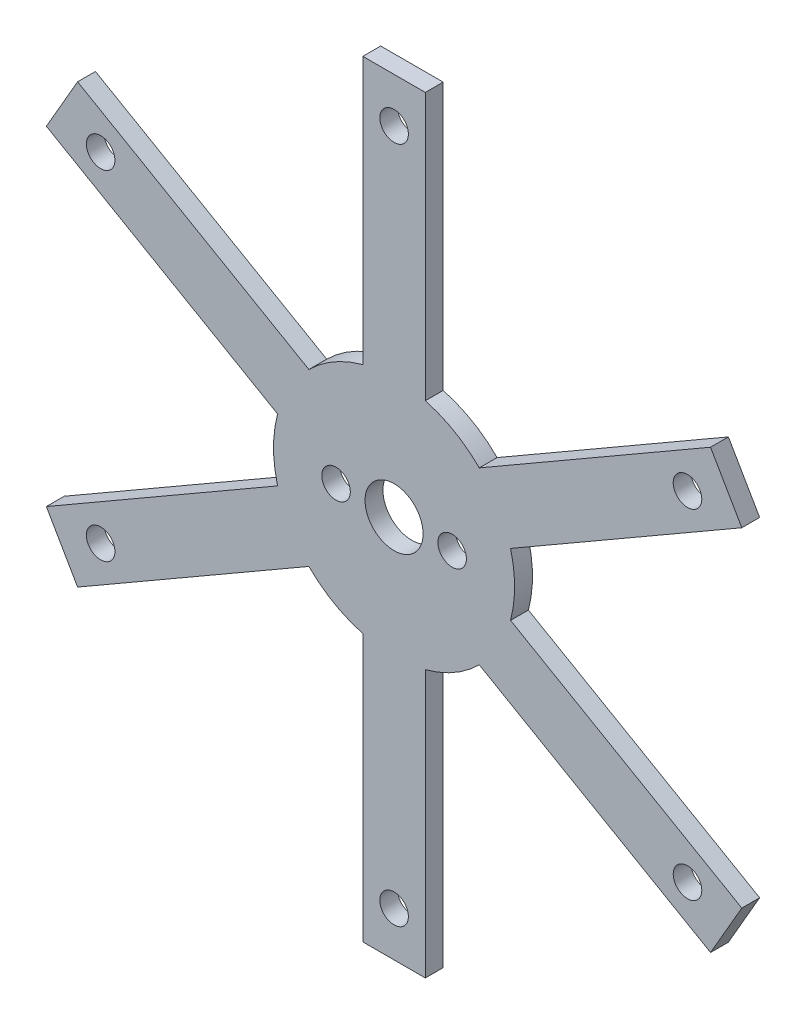
ISO-10303-21;
HEADER;
FILE_DESCRIPTION(('STEP AP214'),'2;1');
FILE_NAME('part.step','',(''),(''),'','','');
FILE_SCHEMA(('AUTOMOTIVE_DESIGN { 1 0 10303 214 1 1 1 1 }'));
ENDSEC;
DATA;
#1=APPLICATION_CONTEXT('core data for automotive mechanical design processes');
#2=APPLICATION_PROTOCOL_DEFINITION('international standard','automotive_design',2000,#1);
#3=PRODUCT_CONTEXT('',#1,'mechanical');
#4=PRODUCT('Part','Part','',(#3));
#5=PRODUCT_RELATED_PRODUCT_CATEGORY('part','',(#4));
#6=PRODUCT_DEFINITION_FORMATION('','',#4);
#7=PRODUCT_DEFINITION_CONTEXT('part definition',#1,'design');
#8=PRODUCT_DEFINITION('design','',#6,#7);
#9=PRODUCT_DEFINITION_SHAPE('','',#8);
#10=(LENGTH_UNIT() NAMED_UNIT(*) SI_UNIT(.MILLI.,.METRE.));
#11=(NAMED_UNIT(*) PLANE_ANGLE_UNIT() SI_UNIT($,.RADIAN.));
#12=(NAMED_UNIT(*) SI_UNIT($,.STERADIAN.) SOLID_ANGLE_UNIT());
#13=UNCERTAINTY_MEASURE_WITH_UNIT(LENGTH_MEASURE(1.E-05),#10,'distance_accuracy_value','');
#14=(GEOMETRIC_REPRESENTATION_CONTEXT(3) GLOBAL_UNCERTAINTY_ASSIGNED_CONTEXT((#13)) GLOBAL_UNIT_ASSIGNED_CONTEXT((#10,
#11,#12)) REPRESENTATION_CONTEXT('',''));
#15=CARTESIAN_POINT('',(0.,0.,0.));
#16=DIRECTION('',(0.,0.,1.));
#17=DIRECTION('',(1.,0.,0.));
#18=AXIS2_PLACEMENT_3D('',#15,#16,#17);
#19=CARTESIAN_POINT('',(0.,0.,2.));
#20=DIRECTION('',(0.,0.,-1.));
#21=DIRECTION('',(-1.,0.,0.));
#22=AXIS2_PLACEMENT_3D('',#19,#20,#21);
#23=CYLINDRICAL_SURFACE('',#22,13.5);
#24=DIRECTION('',(0.,0.,-1.));
#25=VECTOR('',#24,1.);
#26=CARTESIAN_POINT('',(13.0415897906363,-3.48811349195695,2.));
#27=LINE('',#26,#25);
#28=CARTESIAN_POINT('',(13.0415897906363,-3.48811349195695,2.));
#29=VERTEX_POINT('',#28);
#30=CARTESIAN_POINT('',(13.0415897906363,-3.48811349195695,0.));
#31=VERTEX_POINT('',#30);
#32=EDGE_CURVE('E314',#29,#31,#27,.T.);
#33=ORIENTED_EDGE('',*,*,#32,.T.);
#34=CARTESIAN_POINT('',(0.,0.,0.));
#35=DIRECTION('',(0.,0.,1.));
#36=DIRECTION('',(1.,0.,0.));
#37=AXIS2_PLACEMENT_3D('',#34,#35,#36);
#38=CIRCLE('',#37,13.5);
#39=CARTESIAN_POINT('',(13.0415897906362,3.48811349195713,0.));
#40=VERTEX_POINT('',#39);
#41=EDGE_CURVE('E384',#31,#40,#38,.T.);
#42=ORIENTED_EDGE('',*,*,#41,.T.);
#43=DIRECTION('',(0.,0.,-1.));
#44=VECTOR('',#43,1.);
#45=CARTESIAN_POINT('',(13.0415897906362,3.48811349195713,2.));
#46=LINE('',#45,#44);
#47=CARTESIAN_POINT('',(13.0415897906362,3.48811349195713,2.));
#48=VERTEX_POINT('',#47);
#49=EDGE_CURVE('E381',#48,#40,#46,.T.);
#50=ORIENTED_EDGE('',*,*,#49,.F.);
#51=CARTESIAN_POINT('',(0.,0.,2.));
#52=DIRECTION('',(0.,0.,1.));
#53=DIRECTION('',(1.,0.,0.));
#54=AXIS2_PLACEMENT_3D('',#51,#52,#53);
#55=CIRCLE('',#54,13.5);
#56=EDGE_CURVE('E58',#29,#48,#55,.T.);
#57=ORIENTED_EDGE('',*,*,#56,.F.);
#58=EDGE_LOOP('',(#33,#42,#50,#57));
#59=FACE_BOUND('',#58,.T.);
#60=ADVANCED_FACE('F41',(#59),#23,.T.);
#61=CARTESIAN_POINT('',(3.50000000000014,-13.0384048104053,0.));
#62=VERTEX_POINT('',#61);
#63=CARTESIAN_POINT('',(9.54158979063634,-9.55029131844806,0.));
#64=VERTEX_POINT('',#63);
#65=EDGE_CURVE('E446',#62,#64,#38,.T.);
#66=ORIENTED_EDGE('',*,*,#65,.T.);
#67=DIRECTION('',(0.,0.,-1.));
#68=VECTOR('',#67,1.);
#69=CARTESIAN_POINT('',(9.54158979063634,-9.55029131844806,2.));
#70=LINE('',#69,#68);
#71=CARTESIAN_POINT('',(9.54158979063634,-9.55029131844806,2.));
#72=VERTEX_POINT('',#71);
#73=EDGE_CURVE('E66',#72,#64,#70,.T.);
#74=ORIENTED_EDGE('',*,*,#73,.F.);
#75=CARTESIAN_POINT('',(3.50000000000014,-13.0384048104053,2.));
#76=VERTEX_POINT('',#75);
#77=EDGE_CURVE('E404',#76,#72,#55,.T.);
#78=ORIENTED_EDGE('',*,*,#77,.F.);
#79=DIRECTION('',(0.,0.,-1.));
#80=VECTOR('',#79,1.);
#81=CARTESIAN_POINT('',(3.50000000000014,-13.0384048104053,2.));
#82=LINE('',#81,#80);
#83=EDGE_CURVE('E288',#76,#62,#82,.T.);
#84=ORIENTED_EDGE('',*,*,#83,.T.);
#85=EDGE_LOOP('',(#66,#74,#78,#84));
#86=FACE_BOUND('',#85,.T.);
#87=ADVANCED_FACE('F445',(#86),#23,.T.);
#88=CARTESIAN_POINT('',(-9.54158979063621,-9.5502913184482,0.));
#89=VERTEX_POINT('',#88);
#90=CARTESIAN_POINT('',(-3.49999999999986,-13.0384048104053,0.));
#91=VERTEX_POINT('',#90);
#92=EDGE_CURVE('E429',#89,#91,#38,.T.);
#93=ORIENTED_EDGE('',*,*,#92,.T.);
#94=DIRECTION('',(0.,0.,-1.));
#95=VECTOR('',#94,1.);
#96=CARTESIAN_POINT('',(-3.49999999999986,-13.0384048104053,2.));
#97=LINE('',#96,#95);
#98=CARTESIAN_POINT('',(-3.49999999999986,-13.0384048104053,2.));
#99=VERTEX_POINT('',#98);
#100=EDGE_CURVE('E265',#99,#91,#97,.T.);
#101=ORIENTED_EDGE('',*,*,#100,.F.);
#102=CARTESIAN_POINT('',(-9.54158979063621,-9.5502913184482,2.));
#103=VERTEX_POINT('',#102);
#104=EDGE_CURVE('E406',#103,#99,#55,.T.);
#105=ORIENTED_EDGE('',*,*,#104,.F.);
#106=DIRECTION('',(0.,0.,-1.));
#107=VECTOR('',#106,1.);
#108=CARTESIAN_POINT('',(-9.54158979063621,-9.5502913184482,2.));
#109=LINE('',#108,#107);
#110=EDGE_CURVE('E260',#103,#89,#109,.T.);
#111=ORIENTED_EDGE('',*,*,#110,.T.);
#112=EDGE_LOOP('',(#93,#101,#105,#111));
#113=FACE_BOUND('',#112,.T.);
#114=ADVANCED_FACE('F428',(#113),#23,.T.);
#115=CARTESIAN_POINT('',(-13.0415897906362,3.48811349195704,0.));
#116=VERTEX_POINT('',#115);
#117=CARTESIAN_POINT('',(-13.0415897906362,-3.48811349195713,0.));
#118=VERTEX_POINT('',#117);
#119=EDGE_CURVE('E488',#116,#118,#38,.T.);
#120=ORIENTED_EDGE('',*,*,#119,.T.);
#121=DIRECTION('',(0.,0.,-1.));
#122=VECTOR('',#121,1.);
#123=CARTESIAN_POINT('',(-13.0415897906362,-3.48811349195713,2.));
#124=LINE('',#123,#122);
#125=CARTESIAN_POINT('',(-13.0415897906362,-3.48811349195713,2.));
#126=VERTEX_POINT('',#125);
#127=EDGE_CURVE('E241',#126,#118,#124,.T.);
#128=ORIENTED_EDGE('',*,*,#127,.F.);
#129=CARTESIAN_POINT('',(-13.0415897906362,3.48811349195704,2.));
#130=VERTEX_POINT('',#129);
#131=EDGE_CURVE('E409',#130,#126,#55,.T.);
#132=ORIENTED_EDGE('',*,*,#131,.F.);
#133=DIRECTION('',(0.,0.,-1.));
#134=VECTOR('',#133,1.);
#135=CARTESIAN_POINT('',(-13.0415897906362,3.48811349195704,2.));
#136=LINE('',#135,#134);
#137=EDGE_CURVE('E235',#130,#116,#136,.T.);
#138=ORIENTED_EDGE('',*,*,#137,.T.);
#139=EDGE_LOOP('',(#120,#128,#132,#138));
#140=FACE_BOUND('',#139,.T.);
#141=ADVANCED_FACE('F491',(#140),#23,.T.);
#142=CARTESIAN_POINT('',(-3.50000000000005,13.0384048104053,0.));
#143=VERTEX_POINT('',#142);
#144=CARTESIAN_POINT('',(-9.54158979063627,9.55029131844813,0.));
#145=VERTEX_POINT('',#144);
#146=EDGE_CURVE('E395',#143,#145,#38,.T.);
#147=ORIENTED_EDGE('',*,*,#146,.T.);
#148=DIRECTION('',(0.,0.,-1.));
#149=VECTOR('',#148,1.);
#150=CARTESIAN_POINT('',(-9.54158979063627,9.55029131844813,2.));
#151=LINE('',#150,#149);
#152=CARTESIAN_POINT('',(-9.54158979063627,9.55029131844813,2.));
#153=VERTEX_POINT('',#152);
#154=EDGE_CURVE('E216',#153,#145,#151,.T.);
#155=ORIENTED_EDGE('',*,*,#154,.F.);
#156=CARTESIAN_POINT('',(-3.50000000000005,13.0384048104053,2.));
#157=VERTEX_POINT('',#156);
#158=EDGE_CURVE('E228',#157,#153,#55,.T.);
#159=ORIENTED_EDGE('',*,*,#158,.F.);
#160=DIRECTION('',(0.,0.,-1.));
#161=VECTOR('',#160,1.);
#162=CARTESIAN_POINT('',(-3.50000000000005,13.0384048104053,2.));
#163=LINE('',#162,#161);
#164=EDGE_CURVE('E339',#157,#143,#163,.T.);
#165=ORIENTED_EDGE('',*,*,#164,.T.);
#166=EDGE_LOOP('',(#147,#155,#159,#165));
#167=FACE_BOUND('',#166,.T.);
#168=ADVANCED_FACE('F486',(#167),#23,.T.);
#169=CARTESIAN_POINT('',(0.,0.,2.));
#170=DIRECTION('',(0.,0.,-1.));
#171=DIRECTION('',(-1.,0.,0.));
#172=AXIS2_PLACEMENT_3D('',#169,#170,#171);
#173=CYLINDRICAL_SURFACE('',#172,3.25);
#174=CARTESIAN_POINT('',(0.,0.,2.));
#175=DIRECTION('',(0.,0.,1.));
#176=DIRECTION('',(1.,0.,0.));
#177=AXIS2_PLACEMENT_3D('',#174,#175,#176);
#178=CIRCLE('',#177,3.25);
#179=CARTESIAN_POINT('',(3.25,0.,2.));
#180=VERTEX_POINT('',#179);
#181=EDGE_CURVE('E50',#180,#180,#178,.T.);
#182=ORIENTED_EDGE('',*,*,#181,.T.);
#183=EDGE_LOOP('',(#182));
#184=FACE_BOUND('',#183,.T.);
#185=CARTESIAN_POINT('',(0.,0.,0.));
#186=DIRECTION('',(0.,0.,1.));
#187=DIRECTION('',(1.,0.,0.));
#188=AXIS2_PLACEMENT_3D('',#185,#186,#187);
#189=CIRCLE('',#188,3.25);
#190=CARTESIAN_POINT('',(3.25,0.,0.));
#191=VERTEX_POINT('',#190);
#192=EDGE_CURVE('E397',#191,#191,#189,.T.);
#193=ORIENTED_EDGE('',*,*,#192,.F.);
#194=EDGE_LOOP('',(#193));
#195=FACE_BOUND('',#194,.T.);
#196=ADVANCED_FACE('F497',(#184,#195),#173,.F.);
#197=CARTESIAN_POINT('',(6.5,0.,2.));
#198=DIRECTION('',(0.,0.,-1.));
#199=DIRECTION('',(-1.,0.,0.));
#200=AXIS2_PLACEMENT_3D('',#197,#198,#199);
#201=CYLINDRICAL_SURFACE('',#200,1.6);
#202=CARTESIAN_POINT('',(6.5,0.,2.));
#203=DIRECTION('',(0.,0.,1.));
#204=DIRECTION('',(1.,0.,0.));
#205=AXIS2_PLACEMENT_3D('',#202,#203,#204);
#206=CIRCLE('',#205,1.6);
#207=CARTESIAN_POINT('',(8.1,0.,2.));
#208=VERTEX_POINT('',#207);
#209=EDGE_CURVE('E387',#208,#208,#206,.T.);
#210=ORIENTED_EDGE('',*,*,#209,.T.);
#211=EDGE_LOOP('',(#210));
#212=FACE_BOUND('',#211,.T.);
#213=CARTESIAN_POINT('',(6.5,0.,0.));
#214=DIRECTION('',(0.,0.,1.));
#215=DIRECTION('',(1.,0.,0.));
#216=AXIS2_PLACEMENT_3D('',#213,#214,#215);
#217=CIRCLE('',#216,1.6);
#218=CARTESIAN_POINT('',(8.1,0.,0.));
#219=VERTEX_POINT('',#218);
#220=EDGE_CURVE('E394',#219,#219,#217,.T.);
#221=ORIENTED_EDGE('',*,*,#220,.F.);
#222=EDGE_LOOP('',(#221));
#223=FACE_BOUND('',#222,.T.);
#224=ADVANCED_FACE('F505',(#212,#223),#201,.F.);
#225=CARTESIAN_POINT('',(9.54158979063621,9.5502913184482,0.));
#226=VERTEX_POINT('',#225);
#227=CARTESIAN_POINT('',(3.49999999999995,13.0384048104053,0.));
#228=VERTEX_POINT('',#227);
#229=EDGE_CURVE('E392',#226,#228,#38,.T.);
#230=ORIENTED_EDGE('',*,*,#229,.T.);
#231=DIRECTION('',(0.,0.,-1.));
#232=VECTOR('',#231,1.);
#233=CARTESIAN_POINT('',(3.49999999999995,13.0384048104053,2.));
#234=LINE('',#233,#232);
#235=CARTESIAN_POINT('',(3.49999999999995,13.0384048104053,2.));
#236=VERTEX_POINT('',#235);
#237=EDGE_CURVE('E353',#236,#228,#234,.T.);
#238=ORIENTED_EDGE('',*,*,#237,.F.);
#239=CARTESIAN_POINT('',(9.54158979063621,9.5502913184482,2.));
#240=VERTEX_POINT('',#239);
#241=EDGE_CURVE('E385',#240,#236,#55,.T.);
#242=ORIENTED_EDGE('',*,*,#241,.F.);
#243=DIRECTION('',(0.,0.,-1.));
#244=VECTOR('',#243,1.);
#245=CARTESIAN_POINT('',(9.54158979063621,9.5502913184482,2.));
#246=LINE('',#245,#244);
#247=EDGE_CURVE('E367',#240,#226,#246,.T.);
#248=ORIENTED_EDGE('',*,*,#247,.T.);
#249=EDGE_LOOP('',(#230,#238,#242,#248));
#250=FACE_BOUND('',#249,.T.);
#251=ADVANCED_FACE('F43',(#250),#23,.T.);
#252=CARTESIAN_POINT('',(-6.5,0.,2.));
#253=DIRECTION('',(0.,0.,-1.));
#254=DIRECTION('',(-1.,0.,0.));
#255=AXIS2_PLACEMENT_3D('',#252,#253,#254);
#256=CYLINDRICAL_SURFACE('',#255,1.6);
#257=CARTESIAN_POINT('',(-6.5,0.,2.));
#258=DIRECTION('',(0.,0.,1.));
#259=DIRECTION('',(1.,0.,0.));
#260=AXIS2_PLACEMENT_3D('',#257,#258,#259);
#261=CIRCLE('',#260,1.6);
#262=CARTESIAN_POINT('',(-4.9,0.,2.));
#263=VERTEX_POINT('',#262);
#264=EDGE_CURVE('E11',#263,#263,#261,.T.);
#265=ORIENTED_EDGE('',*,*,#264,.T.);
#266=EDGE_LOOP('',(#265));
#267=FACE_BOUND('',#266,.T.);
#268=CARTESIAN_POINT('',(-6.5,0.,0.));
#269=DIRECTION('',(0.,0.,1.));
#270=DIRECTION('',(1.,0.,0.));
#271=AXIS2_PLACEMENT_3D('',#268,#269,#270);
#272=CIRCLE('',#271,1.6);
#273=CARTESIAN_POINT('',(-4.9,0.,0.));
#274=VERTEX_POINT('',#273);
#275=EDGE_CURVE('E45',#274,#274,#272,.T.);
#276=ORIENTED_EDGE('',*,*,#275,.F.);
#277=EDGE_LOOP('',(#276));
#278=FACE_BOUND('',#277,.T.);
#279=ADVANCED_FACE('F504',(#267,#278),#256,.F.);
#280=CARTESIAN_POINT('',(0.,0.,2.));
#281=DIRECTION('',(0.,0.,1.));
#282=DIRECTION('',(1.,0.,0.));
#283=AXIS2_PLACEMENT_3D('',#280,#281,#282);
#284=PLANE('',#283);
#285=CARTESIAN_POINT('',(0.,37.94,2.));
#286=DIRECTION('',(0.,0.,1.));
#287=DIRECTION('',(0.499999999999998,0.86602540378444,0.));
#288=AXIS2_PLACEMENT_3D('',#285,#286,#287);
#289=CIRCLE('',#288,1.6);
#290=CARTESIAN_POINT('',(0.799999999999979,39.3256406460551,2.));
#291=VERTEX_POINT('',#290);
#292=EDGE_CURVE('E589',#291,#291,#289,.T.);
#293=ORIENTED_EDGE('',*,*,#292,.F.);
#294=EDGE_LOOP('',(#293));
#295=FACE_BOUND('',#294,.T.);
#296=CARTESIAN_POINT('',(-32.8570038195817,18.9699999999999,2.));
#297=DIRECTION('',(0.,0.,1.));
#298=DIRECTION('',(-0.500000000000004,0.866025403784436,0.));
#299=AXIS2_PLACEMENT_3D('',#296,#297,#298);
#300=CIRCLE('',#299,1.6);
#301=CARTESIAN_POINT('',(-33.6570038195817,20.355640646055,2.));
#302=VERTEX_POINT('',#301);
#303=EDGE_CURVE('E600',#302,#302,#300,.T.);
#304=ORIENTED_EDGE('',*,*,#303,.F.);
#305=EDGE_LOOP('',(#304));
#306=FACE_BOUND('',#305,.T.);
#307=CARTESIAN_POINT('',(-32.8570038195816,-18.9699999999999,2.));
#308=DIRECTION('',(0.,0.,1.));
#309=DIRECTION('',(-1.,0.,0.));
#310=AXIS2_PLACEMENT_3D('',#307,#308,#309);
#311=CIRCLE('',#310,1.6);
#312=CARTESIAN_POINT('',(-34.4570038195816,-18.9699999999999,2.));
#313=VERTEX_POINT('',#312);
#314=EDGE_CURVE('E606',#313,#313,#311,.T.);
#315=ORIENTED_EDGE('',*,*,#314,.F.);
#316=EDGE_LOOP('',(#315));
#317=FACE_BOUND('',#316,.T.);
#318=CARTESIAN_POINT('',(2.77555756156289E-13,-37.94,2.));
#319=DIRECTION('',(0.,0.,1.));
#320=DIRECTION('',(-0.499999999999992,-0.866025403784443,0.));
#321=AXIS2_PLACEMENT_3D('',#318,#319,#320);
#322=CIRCLE('',#321,1.6);
#323=CARTESIAN_POINT('',(-0.799999999999709,-39.3256406460551,2.));
#324=VERTEX_POINT('',#323);
#325=EDGE_CURVE('E612',#324,#324,#322,.T.);
#326=ORIENTED_EDGE('',*,*,#325,.F.);
#327=EDGE_LOOP('',(#326));
#328=FACE_BOUND('',#327,.T.);
#329=CARTESIAN_POINT('',(32.8570038195818,-18.9699999999997,2.));
#330=DIRECTION('',(0.,0.,1.));
#331=DIRECTION('',(0.50000000000001,-0.866025403784433,0.));
#332=AXIS2_PLACEMENT_3D('',#329,#330,#331);
#333=CIRCLE('',#332,1.6);
#334=CARTESIAN_POINT('',(33.6570038195818,-20.3556406460548,2.));
#335=VERTEX_POINT('',#334);
#336=EDGE_CURVE('E618',#335,#335,#333,.T.);
#337=ORIENTED_EDGE('',*,*,#336,.F.);
#338=EDGE_LOOP('',(#337));
#339=FACE_BOUND('',#338,.T.);
#340=CARTESIAN_POINT('',(32.8570038195816,18.9699999999999,2.));
#341=DIRECTION('',(0.,0.,1.));
#342=DIRECTION('',(1.,0.,0.));
#343=AXIS2_PLACEMENT_3D('',#340,#341,#342);
#344=CIRCLE('',#343,1.6);
#345=CARTESIAN_POINT('',(34.4570038195816,18.9699999999999,2.));
#346=VERTEX_POINT('',#345);
#347=EDGE_CURVE('E593',#346,#346,#344,.T.);
#348=ORIENTED_EDGE('',*,*,#347,.F.);
#349=EDGE_LOOP('',(#348));
#350=FACE_BOUND('',#349,.T.);
#351=ORIENTED_EDGE('',*,*,#241,.T.);
#352=DIRECTION('',(0.,-1.,0.));
#353=VECTOR('',#352,1.);
#354=CARTESIAN_POINT('',(3.5,0.,2.));
#355=LINE('',#354,#353);
#356=CARTESIAN_POINT('',(3.49999999999984,42.94,2.));
#357=VERTEX_POINT('',#356);
#358=EDGE_CURVE('E330',#357,#236,#355,.T.);
#359=ORIENTED_EDGE('',*,*,#358,.F.);
#360=DIRECTION('',(1.,0.,0.));
#361=VECTOR('',#360,1.);
#362=CARTESIAN_POINT('',(0.,42.94,2.));
#363=LINE('',#362,#361);
#364=CARTESIAN_POINT('',(-3.50000000000016,42.94,2.));
#365=VERTEX_POINT('',#364);
#366=EDGE_CURVE('E333',#365,#357,#363,.T.);
#367=ORIENTED_EDGE('',*,*,#366,.F.);
#368=DIRECTION('',(0.,-1.,0.));
#369=VECTOR('',#368,1.);
#370=CARTESIAN_POINT('',(-3.5,0.,2.));
#371=LINE('',#370,#369);
#372=EDGE_CURVE('E337',#365,#157,#371,.T.);
#373=ORIENTED_EDGE('',*,*,#372,.T.);
#374=ORIENTED_EDGE('',*,*,#158,.T.);
#375=DIRECTION('',(0.866025403784442,-0.499999999999995,0.));
#376=VECTOR('',#375,1.);
#377=CARTESIAN_POINT('',(1.74999999999998,3.03108891324555,2.));
#378=LINE('',#377,#376);
#379=CARTESIAN_POINT('',(-35.4371308385039,24.5010889132453,2.));
#380=VERTEX_POINT('',#379);
#381=EDGE_CURVE('E209',#380,#153,#378,.T.);
#382=ORIENTED_EDGE('',*,*,#381,.F.);
#383=DIRECTION('',(0.499999999999998,0.86602540378444,0.));
#384=VECTOR('',#383,1.);
#385=CARTESIAN_POINT('',(-37.1871308385039,21.4699999999999,2.));
#386=LINE('',#385,#384);
#387=CARTESIAN_POINT('',(-38.9371308385039,18.4389110867542,2.));
#388=VERTEX_POINT('',#387);
#389=EDGE_CURVE('E226',#388,#380,#386,.T.);
#390=ORIENTED_EDGE('',*,*,#389,.F.);
#391=DIRECTION('',(0.866025403784442,-0.499999999999995,0.));
#392=VECTOR('',#391,1.);
#393=CARTESIAN_POINT('',(-1.74999999999998,-3.03108891324554,2.));
#394=LINE('',#393,#392);
#395=EDGE_CURVE('E233',#388,#130,#394,.T.);
#396=ORIENTED_EDGE('',*,*,#395,.T.);
#397=ORIENTED_EDGE('',*,*,#131,.T.);
#398=DIRECTION('',(0.866025403784438,0.500000000000001,0.));
#399=VECTOR('',#398,1.);
#400=CARTESIAN_POINT('',(-1.75,3.03108891324553,2.));
#401=LINE('',#400,#399);
#402=CARTESIAN_POINT('',(-38.9371308385038,-18.4389110867545,2.));
#403=VERTEX_POINT('',#402);
#404=EDGE_CURVE('E250',#403,#126,#401,.T.);
#405=ORIENTED_EDGE('',*,*,#404,.F.);
#406=DIRECTION('',(-0.499999999999998,0.86602540378444,0.));
#407=VECTOR('',#406,1.);
#408=CARTESIAN_POINT('',(-37.1871308385038,-21.4699999999999,2.));
#409=LINE('',#408,#407);
#410=CARTESIAN_POINT('',(-35.4371308385038,-24.5010889132456,2.));
#411=VERTEX_POINT('',#410);
#412=EDGE_CURVE('E253',#411,#403,#409,.T.);
#413=ORIENTED_EDGE('',*,*,#412,.F.);
#414=DIRECTION('',(0.866025403784438,0.500000000000001,0.));
#415=VECTOR('',#414,1.);
#416=CARTESIAN_POINT('',(1.75,-3.03108891324553,2.));
#417=LINE('',#416,#415);
#418=EDGE_CURVE('E257',#411,#103,#417,.T.);
#419=ORIENTED_EDGE('',*,*,#418,.T.);
#420=ORIENTED_EDGE('',*,*,#104,.T.);
#421=DIRECTION('',(0.,1.,0.));
#422=VECTOR('',#421,1.);
#423=CARTESIAN_POINT('',(-3.5,0.,2.));
#424=LINE('',#423,#422);
#425=CARTESIAN_POINT('',(-3.49999999999955,-42.94,2.));
#426=VERTEX_POINT('',#425);
#427=EDGE_CURVE('E278',#426,#99,#424,.T.);
#428=ORIENTED_EDGE('',*,*,#427,.F.);
#429=DIRECTION('',(-1.,0.,0.));
#430=VECTOR('',#429,1.);
#431=CARTESIAN_POINT('',(3.12250225675825E-13,-42.94,2.));
#432=LINE('',#431,#430);
#433=CARTESIAN_POINT('',(3.50000000000046,-42.94,2.));
#434=VERTEX_POINT('',#433);
#435=EDGE_CURVE('E281',#434,#426,#432,.T.);
#436=ORIENTED_EDGE('',*,*,#435,.F.);
#437=DIRECTION('',(0.,1.,0.));
#438=VECTOR('',#437,1.);
#439=CARTESIAN_POINT('',(3.5,0.,2.));
#440=LINE('',#439,#438);
#441=EDGE_CURVE('E285',#434,#76,#440,.T.);
#442=ORIENTED_EDGE('',*,*,#441,.T.);
#443=ORIENTED_EDGE('',*,*,#77,.T.);
#444=DIRECTION('',(-0.866025403784445,0.499999999999989,0.));
#445=VECTOR('',#444,1.);
#446=CARTESIAN_POINT('',(-1.74999999999996,-3.03108891324556,2.));
#447=LINE('',#446,#445);
#448=CARTESIAN_POINT('',(35.4371308385041,-24.5010889132451,2.));
#449=VERTEX_POINT('',#448);
#450=EDGE_CURVE('E305',#449,#72,#447,.T.);
#451=ORIENTED_EDGE('',*,*,#450,.F.);
#452=DIRECTION('',(-0.499999999999992,-0.866025403784444,0.));
#453=VECTOR('',#452,1.);
#454=CARTESIAN_POINT('',(37.187130838504,-21.4699999999996,2.));
#455=LINE('',#454,#453);
#456=CARTESIAN_POINT('',(38.9371308385041,-18.438911086754,2.));
#457=VERTEX_POINT('',#456);
#458=EDGE_CURVE('E308',#457,#449,#455,.T.);
#459=ORIENTED_EDGE('',*,*,#458,.F.);
#460=DIRECTION('',(-0.866025403784445,0.499999999999989,0.));
#461=VECTOR('',#460,1.);
#462=CARTESIAN_POINT('',(1.74999999999996,3.03108891324556,2.));
#463=LINE('',#462,#461);
#464=EDGE_CURVE('E312',#457,#29,#463,.T.);
#465=ORIENTED_EDGE('',*,*,#464,.T.);
#466=ORIENTED_EDGE('',*,*,#56,.T.);
#467=DIRECTION('',(-0.866025403784438,-0.500000000000001,0.));
#468=VECTOR('',#467,1.);
#469=CARTESIAN_POINT('',(1.75,-3.03108891324553,2.));
#470=LINE('',#469,#468);
#471=CARTESIAN_POINT('',(38.9371308385038,18.4389110867545,2.));
#472=VERTEX_POINT('',#471);
#473=EDGE_CURVE('E357',#472,#48,#470,.T.);
#474=ORIENTED_EDGE('',*,*,#473,.F.);
#475=DIRECTION('',(0.499999999999998,-0.86602540378444,0.));
#476=VECTOR('',#475,1.);
#477=CARTESIAN_POINT('',(37.1871308385038,21.4699999999999,2.));
#478=LINE('',#477,#476);
#479=CARTESIAN_POINT('',(35.4371308385038,24.5010889132456,2.));
#480=VERTEX_POINT('',#479);
#481=EDGE_CURVE('E360',#480,#472,#478,.T.);
#482=ORIENTED_EDGE('',*,*,#481,.F.);
#483=DIRECTION('',(-0.866025403784438,-0.500000000000001,0.));
#484=VECTOR('',#483,1.);
#485=CARTESIAN_POINT('',(-1.75,3.03108891324553,2.));
#486=LINE('',#485,#484);
#487=EDGE_CURVE('E364',#480,#240,#486,.T.);
#488=ORIENTED_EDGE('',*,*,#487,.T.);
#489=EDGE_LOOP('',(#351,#359,#367,#373,#374,#382,#390,#396,#397,#405,#413,#419,#420,#428,#436,
#442,#443,#451,#459,#465,#466,#474,#482,#488));
#490=FACE_BOUND('',#489,.T.);
#491=ORIENTED_EDGE('',*,*,#209,.F.);
#492=EDGE_LOOP('',(#491));
#493=FACE_BOUND('',#492,.T.);
#494=ORIENTED_EDGE('',*,*,#181,.F.);
#495=EDGE_LOOP('',(#494));
#496=FACE_BOUND('',#495,.T.);
#497=ORIENTED_EDGE('',*,*,#264,.F.);
#498=EDGE_LOOP('',(#497));
#499=FACE_BOUND('',#498,.T.);
#500=ADVANCED_FACE('F223',(#295,#306,#317,#328,#339,#350,#490,#493,#496,#499),#284,.T.);
#501=CARTESIAN_POINT('',(0.,0.,0.));
#502=DIRECTION('',(0.,0.,1.));
#503=DIRECTION('',(1.,0.,0.));
#504=AXIS2_PLACEMENT_3D('',#501,#502,#503);
#505=PLANE('',#504);
#506=CARTESIAN_POINT('',(0.,37.94,0.));
#507=DIRECTION('',(0.,0.,1.));
#508=DIRECTION('',(1.,0.,0.));
#509=AXIS2_PLACEMENT_3D('',#506,#507,#508);
#510=CIRCLE('',#509,1.6);
#511=CARTESIAN_POINT('',(1.59999999999998,37.94,0.));
#512=VERTEX_POINT('',#511);
#513=EDGE_CURVE('E592',#512,#512,#510,.F.);
#514=ORIENTED_EDGE('',*,*,#513,.F.);
#515=EDGE_LOOP('',(#514));
#516=FACE_BOUND('',#515,.T.);
#517=CARTESIAN_POINT('',(-32.8570038195817,18.9699999999999,0.));
#518=DIRECTION('',(0.,0.,1.));
#519=DIRECTION('',(1.,0.,0.));
#520=AXIS2_PLACEMENT_3D('',#517,#518,#519);
#521=CIRCLE('',#520,1.6);
#522=CARTESIAN_POINT('',(-31.2570038195817,18.9699999999999,0.));
#523=VERTEX_POINT('',#522);
#524=EDGE_CURVE('E597',#523,#523,#521,.F.);
#525=ORIENTED_EDGE('',*,*,#524,.F.);
#526=EDGE_LOOP('',(#525));
#527=FACE_BOUND('',#526,.T.);
#528=CARTESIAN_POINT('',(-32.8570038195816,-18.9699999999999,0.));
#529=DIRECTION('',(0.,0.,1.));
#530=DIRECTION('',(1.,0.,0.));
#531=AXIS2_PLACEMENT_3D('',#528,#529,#530);
#532=CIRCLE('',#531,1.6);
#533=CARTESIAN_POINT('',(-31.2570038195816,-18.9699999999999,0.));
#534=VERTEX_POINT('',#533);
#535=EDGE_CURVE('E603',#534,#534,#532,.F.);
#536=ORIENTED_EDGE('',*,*,#535,.F.);
#537=EDGE_LOOP('',(#536));
#538=FACE_BOUND('',#537,.T.);
#539=CARTESIAN_POINT('',(2.77555756156289E-13,-37.94,0.));
#540=DIRECTION('',(0.,0.,1.));
#541=DIRECTION('',(1.,0.,0.));
#542=AXIS2_PLACEMENT_3D('',#539,#540,#541);
#543=CIRCLE('',#542,1.6);
#544=CARTESIAN_POINT('',(1.60000000000028,-37.94,0.));
#545=VERTEX_POINT('',#544);
#546=EDGE_CURVE('E609',#545,#545,#543,.F.);
#547=ORIENTED_EDGE('',*,*,#546,.F.);
#548=EDGE_LOOP('',(#547));
#549=FACE_BOUND('',#548,.T.);
#550=CARTESIAN_POINT('',(32.8570038195818,-18.9699999999997,0.));
#551=DIRECTION('',(0.,0.,1.));
#552=DIRECTION('',(1.,0.,0.));
#553=AXIS2_PLACEMENT_3D('',#550,#551,#552);
#554=CIRCLE('',#553,1.6);
#555=CARTESIAN_POINT('',(34.4570038195818,-18.9699999999997,0.));
#556=VERTEX_POINT('',#555);
#557=EDGE_CURVE('E615',#556,#556,#554,.F.);
#558=ORIENTED_EDGE('',*,*,#557,.F.);
#559=EDGE_LOOP('',(#558));
#560=FACE_BOUND('',#559,.T.);
#561=CARTESIAN_POINT('',(32.8570038195816,18.9699999999999,0.));
#562=DIRECTION('',(0.,0.,1.));
#563=DIRECTION('',(1.,0.,0.));
#564=AXIS2_PLACEMENT_3D('',#561,#562,#563);
#565=CIRCLE('',#564,1.6);
#566=CARTESIAN_POINT('',(34.4570038195816,18.9699999999999,0.));
#567=VERTEX_POINT('',#566);
#568=EDGE_CURVE('E319',#567,#567,#565,.F.);
#569=ORIENTED_EDGE('',*,*,#568,.F.);
#570=EDGE_LOOP('',(#569));
#571=FACE_BOUND('',#570,.T.);
#572=ORIENTED_EDGE('',*,*,#229,.F.);
#573=DIRECTION('',(-0.866025403784438,-0.500000000000001,0.));
#574=VECTOR('',#573,1.);
#575=CARTESIAN_POINT('',(-1.75,3.03108891324553,0.));
#576=LINE('',#575,#574);
#577=CARTESIAN_POINT('',(35.4371308385038,24.5010889132456,0.));
#578=VERTEX_POINT('',#577);
#579=EDGE_CURVE('E361',#578,#226,#576,.T.);
#580=ORIENTED_EDGE('',*,*,#579,.F.);
#581=DIRECTION('',(0.499999999999998,-0.86602540378444,0.));
#582=VECTOR('',#581,1.);
#583=CARTESIAN_POINT('',(37.1871308385038,21.4699999999999,0.));
#584=LINE('',#583,#582);
#585=CARTESIAN_POINT('',(38.9371308385038,18.4389110867545,0.));
#586=VERTEX_POINT('',#585);
#587=EDGE_CURVE('E370',#578,#586,#584,.T.);
#588=ORIENTED_EDGE('',*,*,#587,.T.);
#589=DIRECTION('',(-0.866025403784438,-0.500000000000001,0.));
#590=VECTOR('',#589,1.);
#591=CARTESIAN_POINT('',(1.75,-3.03108891324553,0.));
#592=LINE('',#591,#590);
#593=EDGE_CURVE('E356',#586,#40,#592,.T.);
#594=ORIENTED_EDGE('',*,*,#593,.T.);
#595=ORIENTED_EDGE('',*,*,#41,.F.);
#596=DIRECTION('',(-0.866025403784445,0.499999999999989,0.));
#597=VECTOR('',#596,1.);
#598=CARTESIAN_POINT('',(1.74999999999996,3.03108891324556,0.));
#599=LINE('',#598,#597);
#600=CARTESIAN_POINT('',(38.9371308385041,-18.438911086754,0.));
#601=VERTEX_POINT('',#600);
#602=EDGE_CURVE('E309',#601,#31,#599,.T.);
#603=ORIENTED_EDGE('',*,*,#602,.F.);
#604=DIRECTION('',(-0.499999999999992,-0.866025403784444,0.));
#605=VECTOR('',#604,1.);
#606=CARTESIAN_POINT('',(37.187130838504,-21.4699999999996,0.));
#607=LINE('',#606,#605);
#608=CARTESIAN_POINT('',(35.4371308385041,-24.5010889132451,0.));
#609=VERTEX_POINT('',#608);
#610=EDGE_CURVE('E318',#601,#609,#607,.T.);
#611=ORIENTED_EDGE('',*,*,#610,.T.);
#612=DIRECTION('',(-0.866025403784445,0.499999999999989,0.));
#613=VECTOR('',#612,1.);
#614=CARTESIAN_POINT('',(-1.74999999999996,-3.03108891324556,0.));
#615=LINE('',#614,#613);
#616=EDGE_CURVE('E315',#609,#64,#615,.T.);
#617=ORIENTED_EDGE('',*,*,#616,.T.);
#618=ORIENTED_EDGE('',*,*,#65,.F.);
#619=DIRECTION('',(0.,1.,0.));
#620=VECTOR('',#619,1.);
#621=CARTESIAN_POINT('',(3.5,0.,0.));
#622=LINE('',#621,#620);
#623=CARTESIAN_POINT('',(3.50000000000046,-42.94,0.));
#624=VERTEX_POINT('',#623);
#625=EDGE_CURVE('E282',#624,#62,#622,.T.);
#626=ORIENTED_EDGE('',*,*,#625,.F.);
#627=DIRECTION('',(-1.,0.,0.));
#628=VECTOR('',#627,1.);
#629=CARTESIAN_POINT('',(3.12250225675825E-13,-42.94,0.));
#630=LINE('',#629,#628);
#631=CARTESIAN_POINT('',(-3.49999999999955,-42.94,0.));
#632=VERTEX_POINT('',#631);
#633=EDGE_CURVE('E292',#624,#632,#630,.T.);
#634=ORIENTED_EDGE('',*,*,#633,.T.);
#635=DIRECTION('',(0.,1.,0.));
#636=VECTOR('',#635,1.);
#637=CARTESIAN_POINT('',(-3.5,0.,0.));
#638=LINE('',#637,#636);
#639=EDGE_CURVE('E289',#632,#91,#638,.T.);
#640=ORIENTED_EDGE('',*,*,#639,.T.);
#641=ORIENTED_EDGE('',*,*,#92,.F.);
#642=DIRECTION('',(0.866025403784438,0.500000000000001,0.));
#643=VECTOR('',#642,1.);
#644=CARTESIAN_POINT('',(1.75,-3.03108891324553,0.));
#645=LINE('',#644,#643);
#646=CARTESIAN_POINT('',(-35.4371308385038,-24.5010889132456,0.));
#647=VERTEX_POINT('',#646);
#648=EDGE_CURVE('E254',#647,#89,#645,.T.);
#649=ORIENTED_EDGE('',*,*,#648,.F.);
#650=DIRECTION('',(-0.499999999999998,0.86602540378444,0.));
#651=VECTOR('',#650,1.);
#652=CARTESIAN_POINT('',(-37.1871308385038,-21.4699999999999,0.));
#653=LINE('',#652,#651);
#654=CARTESIAN_POINT('',(-38.9371308385038,-18.4389110867545,0.));
#655=VERTEX_POINT('',#654);
#656=EDGE_CURVE('E264',#647,#655,#653,.T.);
#657=ORIENTED_EDGE('',*,*,#656,.T.);
#658=DIRECTION('',(0.866025403784438,0.500000000000001,0.));
#659=VECTOR('',#658,1.);
#660=CARTESIAN_POINT('',(-1.75,3.03108891324553,0.));
#661=LINE('',#660,#659);
#662=EDGE_CURVE('E261',#655,#118,#661,.T.);
#663=ORIENTED_EDGE('',*,*,#662,.T.);
#664=ORIENTED_EDGE('',*,*,#119,.F.);
#665=DIRECTION('',(0.866025403784442,-0.499999999999995,0.));
#666=VECTOR('',#665,1.);
#667=CARTESIAN_POINT('',(-1.74999999999998,-3.03108891324554,0.));
#668=LINE('',#667,#666);
#669=CARTESIAN_POINT('',(-38.9371308385039,18.4389110867542,0.));
#670=VERTEX_POINT('',#669);
#671=EDGE_CURVE('E229',#670,#116,#668,.T.);
#672=ORIENTED_EDGE('',*,*,#671,.F.);
#673=DIRECTION('',(0.499999999999998,0.86602540378444,0.));
#674=VECTOR('',#673,1.);
#675=CARTESIAN_POINT('',(-37.1871308385039,21.4699999999999,0.));
#676=LINE('',#675,#674);
#677=CARTESIAN_POINT('',(-35.4371308385039,24.5010889132453,0.));
#678=VERTEX_POINT('',#677);
#679=EDGE_CURVE('E240',#670,#678,#676,.T.);
#680=ORIENTED_EDGE('',*,*,#679,.T.);
#681=DIRECTION('',(0.866025403784442,-0.499999999999995,0.));
#682=VECTOR('',#681,1.);
#683=CARTESIAN_POINT('',(1.74999999999998,3.03108891324555,0.));
#684=LINE('',#683,#682);
#685=EDGE_CURVE('E211',#678,#145,#684,.T.);
#686=ORIENTED_EDGE('',*,*,#685,.T.);
#687=ORIENTED_EDGE('',*,*,#146,.F.);
#688=DIRECTION('',(0.,-1.,0.));
#689=VECTOR('',#688,1.);
#690=CARTESIAN_POINT('',(-3.5,0.,0.));
#691=LINE('',#690,#689);
#692=CARTESIAN_POINT('',(-3.50000000000016,42.94,0.));
#693=VERTEX_POINT('',#692);
#694=EDGE_CURVE('E334',#693,#143,#691,.T.);
#695=ORIENTED_EDGE('',*,*,#694,.F.);
#696=DIRECTION('',(1.,0.,0.));
#697=VECTOR('',#696,1.);
#698=CARTESIAN_POINT('',(0.,42.94,0.));
#699=LINE('',#698,#697);
#700=CARTESIAN_POINT('',(3.49999999999984,42.94,0.));
#701=VERTEX_POINT('',#700);
#702=EDGE_CURVE('E342',#693,#701,#699,.T.);
#703=ORIENTED_EDGE('',*,*,#702,.T.);
#704=DIRECTION('',(0.,-1.,0.));
#705=VECTOR('',#704,1.);
#706=CARTESIAN_POINT('',(3.5,0.,0.));
#707=LINE('',#706,#705);
#708=EDGE_CURVE('E249',#701,#228,#707,.T.);
#709=ORIENTED_EDGE('',*,*,#708,.T.);
#710=EDGE_LOOP('',(#572,#580,#588,#594,#595,#603,#611,#617,#618,#626,#634,#640,#641,#649,#657,
#663,#664,#672,#680,#686,#687,#695,#703,#709));
#711=FACE_BOUND('',#710,.T.);
#712=ORIENTED_EDGE('',*,*,#220,.T.);
#713=EDGE_LOOP('',(#712));
#714=FACE_BOUND('',#713,.T.);
#715=ORIENTED_EDGE('',*,*,#192,.T.);
#716=EDGE_LOOP('',(#715));
#717=FACE_BOUND('',#716,.T.);
#718=ORIENTED_EDGE('',*,*,#275,.T.);
#719=EDGE_LOOP('',(#718));
#720=FACE_BOUND('',#719,.T.);
#721=ADVANCED_FACE('F434',(#516,#527,#538,#549,#560,#571,#711,#714,#717,#720),#505,.F.);
#722=CARTESIAN_POINT('',(1.75,-3.03108891324553,2.));
#723=DIRECTION('',(0.500000000000001,-0.866025403784438,0.));
#724=DIRECTION('',(0.866025403784438,0.500000000000001,0.));
#725=AXIS2_PLACEMENT_3D('',#722,#723,#724);
#726=PLANE('',#725);
#727=ORIENTED_EDGE('',*,*,#593,.F.);
#728=DIRECTION('',(0.,0.,-1.));
#729=VECTOR('',#728,1.);
#730=CARTESIAN_POINT('',(38.9371308385038,18.4389110867545,2.));
#731=LINE('',#730,#729);
#732=EDGE_CURVE('E379',#472,#586,#731,.T.);
#733=ORIENTED_EDGE('',*,*,#732,.F.);
#734=ORIENTED_EDGE('',*,*,#473,.T.);
#735=ORIENTED_EDGE('',*,*,#49,.T.);
#736=EDGE_LOOP('',(#727,#733,#734,#735));
#737=FACE_BOUND('',#736,.T.);
#738=ADVANCED_FACE('F461',(#737),#726,.T.);
#739=CARTESIAN_POINT('',(37.1871308385038,21.4699999999999,2.));
#740=DIRECTION('',(0.86602540378444,0.499999999999998,0.));
#741=DIRECTION('',(-0.499999999999998,0.86602540378444,0.));
#742=AXIS2_PLACEMENT_3D('',#739,#740,#741);
#743=PLANE('',#742);
#744=ORIENTED_EDGE('',*,*,#587,.F.);
#745=DIRECTION('',(0.,0.,-1.));
#746=VECTOR('',#745,1.);
#747=CARTESIAN_POINT('',(35.4371308385038,24.5010889132456,2.));
#748=LINE('',#747,#746);
#749=EDGE_CURVE('E377',#480,#578,#748,.T.);
#750=ORIENTED_EDGE('',*,*,#749,.F.);
#751=ORIENTED_EDGE('',*,*,#481,.T.);
#752=ORIENTED_EDGE('',*,*,#732,.T.);
#753=EDGE_LOOP('',(#744,#750,#751,#752));
#754=FACE_BOUND('',#753,.T.);
#755=ADVANCED_FACE('F465',(#754),#743,.T.);
#756=CARTESIAN_POINT('',(-1.75,3.03108891324553,2.));
#757=DIRECTION('',(0.500000000000001,-0.866025403784438,0.));
#758=DIRECTION('',(0.866025403784438,0.500000000000001,0.));
#759=AXIS2_PLACEMENT_3D('',#756,#757,#758);
#760=PLANE('',#759);
#761=ORIENTED_EDGE('',*,*,#579,.T.);
#762=ORIENTED_EDGE('',*,*,#247,.F.);
#763=ORIENTED_EDGE('',*,*,#487,.F.);
#764=ORIENTED_EDGE('',*,*,#749,.T.);
#765=EDGE_LOOP('',(#761,#762,#763,#764));
#766=FACE_BOUND('',#765,.T.);
#767=ADVANCED_FACE('F471',(#766),#760,.F.);
#768=CARTESIAN_POINT('',(3.5,0.,2.));
#769=DIRECTION('',(1.,0.,0.));
#770=DIRECTION('',(0.,1.,0.));
#771=AXIS2_PLACEMENT_3D('',#768,#769,#770);
#772=PLANE('',#771);
#773=ORIENTED_EDGE('',*,*,#708,.F.);
#774=DIRECTION('',(0.,0.,-1.));
#775=VECTOR('',#774,1.);
#776=CARTESIAN_POINT('',(3.49999999999984,42.94,2.));
#777=LINE('',#776,#775);
#778=EDGE_CURVE('E351',#357,#701,#777,.T.);
#779=ORIENTED_EDGE('',*,*,#778,.F.);
#780=ORIENTED_EDGE('',*,*,#358,.T.);
#781=ORIENTED_EDGE('',*,*,#237,.T.);
#782=EDGE_LOOP('',(#773,#779,#780,#781));
#783=FACE_BOUND('',#782,.T.);
#784=ADVANCED_FACE('F475',(#783),#772,.T.);
#785=CARTESIAN_POINT('',(0.,42.94,2.));
#786=DIRECTION('',(0.,1.,0.));
#787=DIRECTION('',(-1.,0.,0.));
#788=AXIS2_PLACEMENT_3D('',#785,#786,#787);
#789=PLANE('',#788);
#790=ORIENTED_EDGE('',*,*,#702,.F.);
#791=DIRECTION('',(0.,0.,-1.));
#792=VECTOR('',#791,1.);
#793=CARTESIAN_POINT('',(-3.50000000000016,42.94,2.));
#794=LINE('',#793,#792);
#795=EDGE_CURVE('E349',#365,#693,#794,.T.);
#796=ORIENTED_EDGE('',*,*,#795,.F.);
#797=ORIENTED_EDGE('',*,*,#366,.T.);
#798=ORIENTED_EDGE('',*,*,#778,.T.);
#799=EDGE_LOOP('',(#790,#796,#797,#798));
#800=FACE_BOUND('',#799,.T.);
#801=ADVANCED_FACE('F479',(#800),#789,.T.);
#802=CARTESIAN_POINT('',(-3.5,0.,2.));
#803=DIRECTION('',(1.,0.,0.));
#804=DIRECTION('',(0.,1.,0.));
#805=AXIS2_PLACEMENT_3D('',#802,#803,#804);
#806=PLANE('',#805);
#807=ORIENTED_EDGE('',*,*,#694,.T.);
#808=ORIENTED_EDGE('',*,*,#164,.F.);
#809=ORIENTED_EDGE('',*,*,#372,.F.);
#810=ORIENTED_EDGE('',*,*,#795,.T.);
#811=EDGE_LOOP('',(#807,#808,#809,#810));
#812=FACE_BOUND('',#811,.T.);
#813=ADVANCED_FACE('F484',(#812),#806,.F.);
#814=CARTESIAN_POINT('',(1.74999999999998,3.03108891324555,2.));
#815=DIRECTION('',(0.499999999999995,0.866025403784442,0.));
#816=DIRECTION('',(-0.866025403784442,0.499999999999995,0.));
#817=AXIS2_PLACEMENT_3D('',#814,#815,#816);
#818=PLANE('',#817);
#819=ORIENTED_EDGE('',*,*,#685,.F.);
#820=DIRECTION('',(0.,0.,-1.));
#821=VECTOR('',#820,1.);
#822=CARTESIAN_POINT('',(-35.4371308385039,24.5010889132453,2.));
#823=LINE('',#822,#821);
#824=EDGE_CURVE('E205',#380,#678,#823,.T.);
#825=ORIENTED_EDGE('',*,*,#824,.F.);
#826=ORIENTED_EDGE('',*,*,#381,.T.);
#827=ORIENTED_EDGE('',*,*,#154,.T.);
#828=EDGE_LOOP('',(#819,#825,#826,#827));
#829=FACE_BOUND('',#828,.T.);
#830=ADVANCED_FACE('F207',(#829),#818,.T.);
#831=CARTESIAN_POINT('',(-37.1871308385039,21.4699999999999,2.));
#832=DIRECTION('',(-0.86602540378444,0.499999999999998,0.));
#833=DIRECTION('',(-0.499999999999998,-0.86602540378444,0.));
#834=AXIS2_PLACEMENT_3D('',#831,#832,#833);
#835=PLANE('',#834);
#836=ORIENTED_EDGE('',*,*,#679,.F.);
#837=DIRECTION('',(0.,0.,-1.));
#838=VECTOR('',#837,1.);
#839=CARTESIAN_POINT('',(-38.9371308385039,18.4389110867542,2.));
#840=LINE('',#839,#838);
#841=EDGE_CURVE('E217',#388,#670,#840,.T.);
#842=ORIENTED_EDGE('',*,*,#841,.F.);
#843=ORIENTED_EDGE('',*,*,#389,.T.);
#844=ORIENTED_EDGE('',*,*,#824,.T.);
#845=EDGE_LOOP('',(#836,#842,#843,#844));
#846=FACE_BOUND('',#845,.T.);
#847=ADVANCED_FACE('F231',(#846),#835,.T.);
#848=CARTESIAN_POINT('',(-1.74999999999998,-3.03108891324554,2.));
#849=DIRECTION('',(0.499999999999995,0.866025403784442,0.));
#850=DIRECTION('',(-0.866025403784442,0.499999999999995,0.));
#851=AXIS2_PLACEMENT_3D('',#848,#849,#850);
#852=PLANE('',#851);
#853=ORIENTED_EDGE('',*,*,#671,.T.);
#854=ORIENTED_EDGE('',*,*,#137,.F.);
#855=ORIENTED_EDGE('',*,*,#395,.F.);
#856=ORIENTED_EDGE('',*,*,#841,.T.);
#857=EDGE_LOOP('',(#853,#854,#855,#856));
#858=FACE_BOUND('',#857,.T.);
#859=ADVANCED_FACE('F490',(#858),#852,.F.);
#860=CARTESIAN_POINT('',(-1.75,3.03108891324553,2.));
#861=DIRECTION('',(-0.500000000000001,0.866025403784438,0.));
#862=DIRECTION('',(-0.866025403784438,-0.500000000000001,0.));
#863=AXIS2_PLACEMENT_3D('',#860,#861,#862);
#864=PLANE('',#863);
#865=ORIENTED_EDGE('',*,*,#662,.F.);
#866=DIRECTION('',(0.,0.,-1.));
#867=VECTOR('',#866,1.);
#868=CARTESIAN_POINT('',(-38.9371308385038,-18.4389110867545,2.));
#869=LINE('',#868,#867);
#870=EDGE_CURVE('E274',#403,#655,#869,.T.);
#871=ORIENTED_EDGE('',*,*,#870,.F.);
#872=ORIENTED_EDGE('',*,*,#404,.T.);
#873=ORIENTED_EDGE('',*,*,#127,.T.);
#874=EDGE_LOOP('',(#865,#871,#872,#873));
#875=FACE_BOUND('',#874,.T.);
#876=ADVANCED_FACE('F418',(#875),#864,.T.);
#877=CARTESIAN_POINT('',(-37.1871308385038,-21.4699999999999,2.));
#878=DIRECTION('',(-0.86602540378444,-0.499999999999998,0.));
#879=DIRECTION('',(0.499999999999998,-0.86602540378444,0.));
#880=AXIS2_PLACEMENT_3D('',#877,#878,#879);
#881=PLANE('',#880);
#882=ORIENTED_EDGE('',*,*,#656,.F.);
#883=DIRECTION('',(0.,0.,-1.));
#884=VECTOR('',#883,1.);
#885=CARTESIAN_POINT('',(-35.4371308385038,-24.5010889132456,2.));
#886=LINE('',#885,#884);
#887=EDGE_CURVE('E272',#411,#647,#886,.T.);
#888=ORIENTED_EDGE('',*,*,#887,.F.);
#889=ORIENTED_EDGE('',*,*,#412,.T.);
#890=ORIENTED_EDGE('',*,*,#870,.T.);
#891=EDGE_LOOP('',(#882,#888,#889,#890));
#892=FACE_BOUND('',#891,.T.);
#893=ADVANCED_FACE('F421',(#892),#881,.T.);
#894=CARTESIAN_POINT('',(1.75,-3.03108891324553,2.));
#895=DIRECTION('',(-0.500000000000001,0.866025403784438,0.));
#896=DIRECTION('',(-0.866025403784438,-0.500000000000001,0.));
#897=AXIS2_PLACEMENT_3D('',#894,#895,#896);
#898=PLANE('',#897);
#899=ORIENTED_EDGE('',*,*,#648,.T.);
#900=ORIENTED_EDGE('',*,*,#110,.F.);
#901=ORIENTED_EDGE('',*,*,#418,.F.);
#902=ORIENTED_EDGE('',*,*,#887,.T.);
#903=EDGE_LOOP('',(#899,#900,#901,#902));
#904=FACE_BOUND('',#903,.T.);
#905=ADVANCED_FACE('F425',(#904),#898,.F.);
#906=CARTESIAN_POINT('',(-3.5,0.,2.));
#907=DIRECTION('',(-1.,0.,0.));
#908=DIRECTION('',(0.,-1.,0.));
#909=AXIS2_PLACEMENT_3D('',#906,#907,#908);
#910=PLANE('',#909);
#911=ORIENTED_EDGE('',*,*,#639,.F.);
#912=DIRECTION('',(0.,0.,-1.));
#913=VECTOR('',#912,1.);
#914=CARTESIAN_POINT('',(-3.49999999999955,-42.94,2.));
#915=LINE('',#914,#913);
#916=EDGE_CURVE('E301',#426,#632,#915,.T.);
#917=ORIENTED_EDGE('',*,*,#916,.F.);
#918=ORIENTED_EDGE('',*,*,#427,.T.);
#919=ORIENTED_EDGE('',*,*,#100,.T.);
#920=EDGE_LOOP('',(#911,#917,#918,#919));
#921=FACE_BOUND('',#920,.T.);
#922=ADVANCED_FACE('F432',(#921),#910,.T.);
#923=CARTESIAN_POINT('',(3.12250225675825E-13,-42.94,2.));
#924=DIRECTION('',(0.,-1.,0.));
#925=DIRECTION('',(1.,0.,0.));
#926=AXIS2_PLACEMENT_3D('',#923,#924,#925);
#927=PLANE('',#926);
#928=ORIENTED_EDGE('',*,*,#633,.F.);
#929=DIRECTION('',(0.,0.,-1.));
#930=VECTOR('',#929,1.);
#931=CARTESIAN_POINT('',(3.50000000000046,-42.94,2.));
#932=LINE('',#931,#930);
#933=EDGE_CURVE('E299',#434,#624,#932,.T.);
#934=ORIENTED_EDGE('',*,*,#933,.F.);
#935=ORIENTED_EDGE('',*,*,#435,.T.);
#936=ORIENTED_EDGE('',*,*,#916,.T.);
#937=EDGE_LOOP('',(#928,#934,#935,#936));
#938=FACE_BOUND('',#937,.T.);
#939=ADVANCED_FACE('F439',(#938),#927,.T.);
#940=CARTESIAN_POINT('',(3.5,0.,2.));
#941=DIRECTION('',(-1.,0.,0.));
#942=DIRECTION('',(0.,-1.,0.));
#943=AXIS2_PLACEMENT_3D('',#940,#941,#942);
#944=PLANE('',#943);
#945=ORIENTED_EDGE('',*,*,#625,.T.);
#946=ORIENTED_EDGE('',*,*,#83,.F.);
#947=ORIENTED_EDGE('',*,*,#441,.F.);
#948=ORIENTED_EDGE('',*,*,#933,.T.);
#949=EDGE_LOOP('',(#945,#946,#947,#948));
#950=FACE_BOUND('',#949,.T.);
#951=ADVANCED_FACE('F444',(#950),#944,.F.);
#952=CARTESIAN_POINT('',(-1.74999999999996,-3.03108891324556,2.));
#953=DIRECTION('',(-0.499999999999989,-0.866025403784445,0.));
#954=DIRECTION('',(0.866025403784445,-0.499999999999989,0.));
#955=AXIS2_PLACEMENT_3D('',#952,#953,#954);
#956=PLANE('',#955);
#957=ORIENTED_EDGE('',*,*,#616,.F.);
#958=DIRECTION('',(0.,0.,-1.));
#959=VECTOR('',#958,1.);
#960=CARTESIAN_POINT('',(35.4371308385041,-24.5010889132451,2.));
#961=LINE('',#960,#959);
#962=EDGE_CURVE('E327',#449,#609,#961,.T.);
#963=ORIENTED_EDGE('',*,*,#962,.F.);
#964=ORIENTED_EDGE('',*,*,#450,.T.);
#965=ORIENTED_EDGE('',*,*,#73,.T.);
#966=EDGE_LOOP('',(#957,#963,#964,#965));
#967=FACE_BOUND('',#966,.T.);
#968=ADVANCED_FACE('F449',(#967),#956,.T.);
#969=CARTESIAN_POINT('',(37.187130838504,-21.4699999999996,2.));
#970=DIRECTION('',(0.866025403784443,-0.499999999999992,0.));
#971=DIRECTION('',(0.499999999999992,0.866025403784444,0.));
#972=AXIS2_PLACEMENT_3D('',#969,#970,#971);
#973=PLANE('',#972);
#974=ORIENTED_EDGE('',*,*,#610,.F.);
#975=DIRECTION('',(0.,0.,-1.));
#976=VECTOR('',#975,1.);
#977=CARTESIAN_POINT('',(38.9371308385041,-18.438911086754,2.));
#978=LINE('',#977,#976);
#979=EDGE_CURVE('E325',#457,#601,#978,.T.);
#980=ORIENTED_EDGE('',*,*,#979,.F.);
#981=ORIENTED_EDGE('',*,*,#458,.T.);
#982=ORIENTED_EDGE('',*,*,#962,.T.);
#983=EDGE_LOOP('',(#974,#980,#981,#982));
#984=FACE_BOUND('',#983,.T.);
#985=ADVANCED_FACE('F453',(#984),#973,.T.);
#986=CARTESIAN_POINT('',(1.74999999999996,3.03108891324556,2.));
#987=DIRECTION('',(-0.499999999999989,-0.866025403784445,0.));
#988=DIRECTION('',(0.866025403784445,-0.499999999999989,0.));
#989=AXIS2_PLACEMENT_3D('',#986,#987,#988);
#990=PLANE('',#989);
#991=ORIENTED_EDGE('',*,*,#602,.T.);
#992=ORIENTED_EDGE('',*,*,#32,.F.);
#993=ORIENTED_EDGE('',*,*,#464,.F.);
#994=ORIENTED_EDGE('',*,*,#979,.T.);
#995=EDGE_LOOP('',(#991,#992,#993,#994));
#996=FACE_BOUND('',#995,.T.);
#997=ADVANCED_FACE('F458',(#996),#990,.F.);
#998=CARTESIAN_POINT('',(32.8570038195816,18.9699999999999,-0.00100000000000013));
#999=DIRECTION('',(0.,0.,1.));
#1000=DIRECTION('',(1.,0.,0.));
#1001=AXIS2_PLACEMENT_3D('',#998,#999,#1000);
#1002=CYLINDRICAL_SURFACE('',#1001,1.6);
#1003=ORIENTED_EDGE('',*,*,#347,.T.);
#1004=EDGE_LOOP('',(#1003));
#1005=FACE_BOUND('',#1004,.T.);
#1006=ORIENTED_EDGE('',*,*,#568,.T.);
#1007=EDGE_LOOP('',(#1006));
#1008=FACE_BOUND('',#1007,.T.);
#1009=ADVANCED_FACE('F543',(#1005,#1008),#1002,.F.);
#1010=CARTESIAN_POINT('',(32.8570038195818,-18.9699999999997,-0.00100000000000013));
#1011=DIRECTION('',(0.,0.,1.));
#1012=DIRECTION('',(1.,0.,0.));
#1013=AXIS2_PLACEMENT_3D('',#1010,#1011,#1012);
#1014=CYLINDRICAL_SURFACE('',#1013,1.6);
#1015=ORIENTED_EDGE('',*,*,#336,.T.);
#1016=EDGE_LOOP('',(#1015));
#1017=FACE_BOUND('',#1016,.T.);
#1018=ORIENTED_EDGE('',*,*,#557,.T.);
#1019=EDGE_LOOP('',(#1018));
#1020=FACE_BOUND('',#1019,.T.);
#1021=ADVANCED_FACE('F564',(#1017,#1020),#1014,.F.);
#1022=CARTESIAN_POINT('',(2.77555756156289E-13,-37.94,-0.00100000000000013));
#1023=DIRECTION('',(0.,0.,1.));
#1024=DIRECTION('',(1.,0.,0.));
#1025=AXIS2_PLACEMENT_3D('',#1022,#1023,#1024);
#1026=CYLINDRICAL_SURFACE('',#1025,1.6);
#1027=ORIENTED_EDGE('',*,*,#325,.T.);
#1028=EDGE_LOOP('',(#1027));
#1029=FACE_BOUND('',#1028,.T.);
#1030=ORIENTED_EDGE('',*,*,#546,.T.);
#1031=EDGE_LOOP('',(#1030));
#1032=FACE_BOUND('',#1031,.T.);
#1033=ADVANCED_FACE('F568',(#1029,#1032),#1026,.F.);
#1034=CARTESIAN_POINT('',(-32.8570038195816,-18.9699999999999,-0.00100000000000013));
#1035=DIRECTION('',(0.,0.,1.));
#1036=DIRECTION('',(1.,0.,0.));
#1037=AXIS2_PLACEMENT_3D('',#1034,#1035,#1036);
#1038=CYLINDRICAL_SURFACE('',#1037,1.6);
#1039=ORIENTED_EDGE('',*,*,#314,.T.);
#1040=EDGE_LOOP('',(#1039));
#1041=FACE_BOUND('',#1040,.T.);
#1042=ORIENTED_EDGE('',*,*,#535,.T.);
#1043=EDGE_LOOP('',(#1042));
#1044=FACE_BOUND('',#1043,.T.);
#1045=ADVANCED_FACE('F572',(#1041,#1044),#1038,.F.);
#1046=CARTESIAN_POINT('',(-32.8570038195817,18.9699999999999,-0.00100000000000013));
#1047=DIRECTION('',(0.,0.,1.));
#1048=DIRECTION('',(1.,0.,0.));
#1049=AXIS2_PLACEMENT_3D('',#1046,#1047,#1048);
#1050=CYLINDRICAL_SURFACE('',#1049,1.6);
#1051=ORIENTED_EDGE('',*,*,#303,.T.);
#1052=EDGE_LOOP('',(#1051));
#1053=FACE_BOUND('',#1052,.T.);
#1054=ORIENTED_EDGE('',*,*,#524,.T.);
#1055=EDGE_LOOP('',(#1054));
#1056=FACE_BOUND('',#1055,.T.);
#1057=ADVANCED_FACE('F576',(#1053,#1056),#1050,.F.);
#1058=CARTESIAN_POINT('',(0.,37.94,-0.00100000000000013));
#1059=DIRECTION('',(0.,0.,1.));
#1060=DIRECTION('',(1.,0.,0.));
#1061=AXIS2_PLACEMENT_3D('',#1058,#1059,#1060);
#1062=CYLINDRICAL_SURFACE('',#1061,1.6);
#1063=ORIENTED_EDGE('',*,*,#292,.T.);
#1064=EDGE_LOOP('',(#1063));
#1065=FACE_BOUND('',#1064,.T.);
#1066=ORIENTED_EDGE('',*,*,#513,.T.);
#1067=EDGE_LOOP('',(#1066));
#1068=FACE_BOUND('',#1067,.T.);
#1069=ADVANCED_FACE('F580',(#1065,#1068),#1062,.F.);
#1070=CLOSED_SHELL('',(#60,#87,#114,#141,#168,#196,#224,#251,#279,#500,#721,#738,#755,#767,#784,
#801,#813,#830,#847,#859,#876,#893,#905,#922,#939,#951,#968,#985,#997,#1009,#1021,#1033,#1045,
#1057,#1069));
#1071=MANIFOLD_SOLID_BREP('B2',#1070);
#1072=ADVANCED_BREP_SHAPE_REPRESENTATION('',(#18,#1071),#14);
#1073=SHAPE_DEFINITION_REPRESENTATION(#9,#1072);
ENDSEC;
END-ISO-10303-21;
